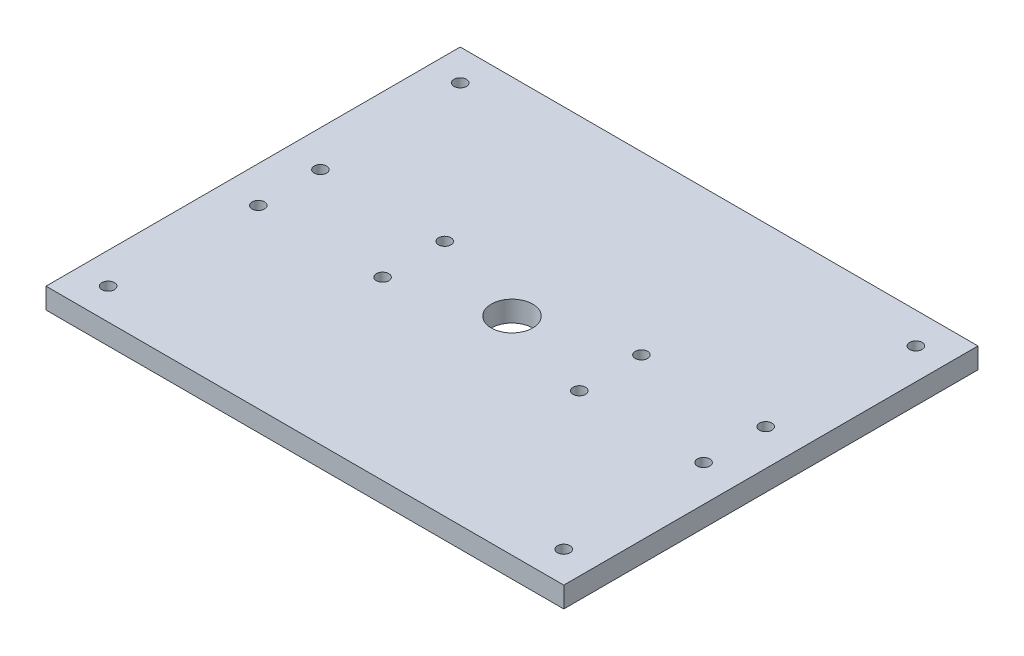
ISO-10303-21;
HEADER;
FILE_DESCRIPTION(('STEP AP214'),'2;1');
FILE_NAME('part.step','',(''),(''),'','','');
FILE_SCHEMA(('AUTOMOTIVE_DESIGN { 1 0 10303 214 1 1 1 1 }'));
ENDSEC;
DATA;
#1=APPLICATION_CONTEXT('core data for automotive mechanical design processes');
#2=APPLICATION_PROTOCOL_DEFINITION('international standard','automotive_design',2000,#1);
#3=PRODUCT_CONTEXT('',#1,'mechanical');
#4=PRODUCT('Part','Part','',(#3));
#5=PRODUCT_RELATED_PRODUCT_CATEGORY('part','',(#4));
#6=PRODUCT_DEFINITION_FORMATION('','',#4);
#7=PRODUCT_DEFINITION_CONTEXT('part definition',#1,'design');
#8=PRODUCT_DEFINITION('design','',#6,#7);
#9=PRODUCT_DEFINITION_SHAPE('','',#8);
#10=(LENGTH_UNIT() NAMED_UNIT(*) SI_UNIT(.MILLI.,.METRE.));
#11=(NAMED_UNIT(*) PLANE_ANGLE_UNIT() SI_UNIT($,.RADIAN.));
#12=(NAMED_UNIT(*) SI_UNIT($,.STERADIAN.) SOLID_ANGLE_UNIT());
#13=UNCERTAINTY_MEASURE_WITH_UNIT(LENGTH_MEASURE(1.E-05),#10,'distance_accuracy_value','');
#14=(GEOMETRIC_REPRESENTATION_CONTEXT(3) GLOBAL_UNCERTAINTY_ASSIGNED_CONTEXT((#13)) GLOBAL_UNIT_ASSIGNED_CONTEXT((#10,
#11,#12)) REPRESENTATION_CONTEXT('',''));
#15=CARTESIAN_POINT('',(0.,0.,0.));
#16=DIRECTION('',(0.,0.,1.));
#17=DIRECTION('',(1.,0.,0.));
#18=AXIS2_PLACEMENT_3D('',#15,#16,#17);
#19=CARTESIAN_POINT('',(0.,4.,0.));
#20=DIRECTION('',(0.,-1.,0.));
#21=DIRECTION('',(0.,0.,-1.));
#22=AXIS2_PLACEMENT_3D('',#19,#20,#21);
#23=PLANE('',#22);
#24=CARTESIAN_POINT('',(50.,4.,-40.));
#25=DIRECTION('',(0.,1.,0.));
#26=DIRECTION('',(0.,0.,1.));
#27=AXIS2_PLACEMENT_3D('',#24,#25,#26);
#28=CIRCLE('',#27,3.99999999999999);
#29=CARTESIAN_POINT('',(50.,4.,-36.));
#30=VERTEX_POINT('',#29);
#31=EDGE_CURVE('E302',#30,#30,#28,.T.);
#32=ORIENTED_EDGE('',*,*,#31,.F.);
#33=EDGE_LOOP('',(#32));
#34=FACE_BOUND('',#33,.T.);
#35=CARTESIAN_POINT('',(6.,4.,-74.));
#36=DIRECTION('',(0.,1.,0.));
#37=DIRECTION('',(0.,0.,1.));
#38=AXIS2_PLACEMENT_3D('',#35,#36,#37);
#39=CIRCLE('',#38,1.19999999999999);
#40=CARTESIAN_POINT('',(6.,4.,-72.8));
#41=VERTEX_POINT('',#40);
#42=EDGE_CURVE('E306',#41,#41,#39,.T.);
#43=ORIENTED_EDGE('',*,*,#42,.F.);
#44=EDGE_LOOP('',(#43));
#45=FACE_BOUND('',#44,.T.);
#46=CARTESIAN_POINT('',(94.,4.,-74.));
#47=DIRECTION('',(0.,1.,0.));
#48=DIRECTION('',(0.,0.,1.));
#49=AXIS2_PLACEMENT_3D('',#46,#47,#48);
#50=CIRCLE('',#49,1.19999999999999);
#51=CARTESIAN_POINT('',(94.,4.,-72.8));
#52=VERTEX_POINT('',#51);
#53=EDGE_CURVE('E181',#52,#52,#50,.T.);
#54=ORIENTED_EDGE('',*,*,#53,.F.);
#55=EDGE_LOOP('',(#54));
#56=FACE_BOUND('',#55,.T.);
#57=CARTESIAN_POINT('',(94.0000000000007,4.,-5.99999999999999));
#58=DIRECTION('',(0.,1.,0.));
#59=DIRECTION('',(0.,0.,1.));
#60=AXIS2_PLACEMENT_3D('',#57,#58,#59);
#61=CIRCLE('',#60,1.19999999999999);
#62=CARTESIAN_POINT('',(94.0000000000007,4.,-4.8));
#63=VERTEX_POINT('',#62);
#64=EDGE_CURVE('E167',#63,#63,#61,.T.);
#65=ORIENTED_EDGE('',*,*,#64,.F.);
#66=EDGE_LOOP('',(#65));
#67=FACE_BOUND('',#66,.T.);
#68=CARTESIAN_POINT('',(6.0000000000004,4.,-5.99999999999999));
#69=DIRECTION('',(0.,1.,0.));
#70=DIRECTION('',(0.,0.,1.));
#71=AXIS2_PLACEMENT_3D('',#68,#69,#70);
#72=CIRCLE('',#71,1.19999999999999);
#73=CARTESIAN_POINT('',(6.0000000000004,4.,-4.8));
#74=VERTEX_POINT('',#73);
#75=EDGE_CURVE('E166',#74,#74,#72,.T.);
#76=ORIENTED_EDGE('',*,*,#75,.F.);
#77=EDGE_LOOP('',(#76));
#78=FACE_BOUND('',#77,.T.);
#79=CARTESIAN_POINT('',(69.,4.,-34.));
#80=DIRECTION('',(0.,1.,0.));
#81=DIRECTION('',(0.,0.,1.));
#82=AXIS2_PLACEMENT_3D('',#79,#80,#81);
#83=CIRCLE('',#82,1.19999999999999);
#84=CARTESIAN_POINT('',(69.,4.,-32.8));
#85=VERTEX_POINT('',#84);
#86=EDGE_CURVE('E158',#85,#85,#83,.T.);
#87=ORIENTED_EDGE('',*,*,#86,.F.);
#88=EDGE_LOOP('',(#87));
#89=FACE_BOUND('',#88,.T.);
#90=CARTESIAN_POINT('',(93.,4.,-46.));
#91=DIRECTION('',(0.,1.,0.));
#92=DIRECTION('',(0.,0.,1.));
#93=AXIS2_PLACEMENT_3D('',#90,#91,#92);
#94=CIRCLE('',#93,1.19999999999999);
#95=CARTESIAN_POINT('',(93.,4.,-44.8));
#96=VERTEX_POINT('',#95);
#97=EDGE_CURVE('E152',#96,#96,#94,.T.);
#98=ORIENTED_EDGE('',*,*,#97,.F.);
#99=EDGE_LOOP('',(#98));
#100=FACE_BOUND('',#99,.T.);
#101=CARTESIAN_POINT('',(7.,4.,-34.));
#102=DIRECTION('',(0.,1.,0.));
#103=DIRECTION('',(0.,0.,1.));
#104=AXIS2_PLACEMENT_3D('',#101,#102,#103);
#105=CIRCLE('',#104,1.2);
#106=CARTESIAN_POINT('',(7.,4.,-32.8));
#107=VERTEX_POINT('',#106);
#108=EDGE_CURVE('E147',#107,#107,#105,.T.);
#109=ORIENTED_EDGE('',*,*,#108,.F.);
#110=EDGE_LOOP('',(#109));
#111=FACE_BOUND('',#110,.T.);
#112=CARTESIAN_POINT('',(31.,4.,-34.));
#113=DIRECTION('',(0.,1.,0.));
#114=DIRECTION('',(0.,0.,1.));
#115=AXIS2_PLACEMENT_3D('',#112,#113,#114);
#116=CIRCLE('',#115,1.2);
#117=CARTESIAN_POINT('',(31.,4.,-32.8));
#118=VERTEX_POINT('',#117);
#119=EDGE_CURVE('E142',#118,#118,#116,.T.);
#120=ORIENTED_EDGE('',*,*,#119,.F.);
#121=EDGE_LOOP('',(#120));
#122=FACE_BOUND('',#121,.T.);
#123=CARTESIAN_POINT('',(31.,4.,-46.));
#124=DIRECTION('',(0.,1.,0.));
#125=DIRECTION('',(0.,0.,1.));
#126=AXIS2_PLACEMENT_3D('',#123,#124,#125);
#127=CIRCLE('',#126,1.2);
#128=CARTESIAN_POINT('',(31.,4.,-44.8));
#129=VERTEX_POINT('',#128);
#130=EDGE_CURVE('E137',#129,#129,#127,.T.);
#131=ORIENTED_EDGE('',*,*,#130,.F.);
#132=EDGE_LOOP('',(#131));
#133=FACE_BOUND('',#132,.T.);
#134=CARTESIAN_POINT('',(7.,4.,-46.));
#135=DIRECTION('',(0.,1.,0.));
#136=DIRECTION('',(0.,0.,1.));
#137=AXIS2_PLACEMENT_3D('',#134,#135,#136);
#138=CIRCLE('',#137,1.2);
#139=CARTESIAN_POINT('',(7.,4.,-44.8));
#140=VERTEX_POINT('',#139);
#141=EDGE_CURVE('E136',#140,#140,#138,.T.);
#142=ORIENTED_EDGE('',*,*,#141,.F.);
#143=EDGE_LOOP('',(#142));
#144=FACE_BOUND('',#143,.T.);
#145=DIRECTION('',(0.,0.,1.));
#146=VECTOR('',#145,1.);
#147=CARTESIAN_POINT('',(0.,4.,0.));
#148=LINE('',#147,#146);
#149=CARTESIAN_POINT('',(0.,4.,-80.));
#150=VERTEX_POINT('',#149);
#151=CARTESIAN_POINT('',(0.,4.,0.));
#152=VERTEX_POINT('',#151);
#153=EDGE_CURVE('E100',#150,#152,#148,.T.);
#154=ORIENTED_EDGE('',*,*,#153,.T.);
#155=DIRECTION('',(1.,0.,0.));
#156=VECTOR('',#155,1.);
#157=CARTESIAN_POINT('',(0.,4.,0.));
#158=LINE('',#157,#156);
#159=CARTESIAN_POINT('',(100.,4.,0.));
#160=VERTEX_POINT('',#159);
#161=EDGE_CURVE('E95',#152,#160,#158,.T.);
#162=ORIENTED_EDGE('',*,*,#161,.T.);
#163=DIRECTION('',(0.,0.,-1.));
#164=VECTOR('',#163,1.);
#165=CARTESIAN_POINT('',(100.,4.,0.));
#166=LINE('',#165,#164);
#167=CARTESIAN_POINT('',(100.,4.,-80.));
#168=VERTEX_POINT('',#167);
#169=EDGE_CURVE('E98',#160,#168,#166,.T.);
#170=ORIENTED_EDGE('',*,*,#169,.T.);
#171=DIRECTION('',(-1.,0.,0.));
#172=VECTOR('',#171,1.);
#173=CARTESIAN_POINT('',(0.,4.,-80.));
#174=LINE('',#173,#172);
#175=EDGE_CURVE('E65',#168,#150,#174,.T.);
#176=ORIENTED_EDGE('',*,*,#175,.T.);
#177=EDGE_LOOP('',(#154,#162,#170,#176));
#178=FACE_BOUND('',#177,.T.);
#179=CARTESIAN_POINT('',(69.,4.,-46.));
#180=DIRECTION('',(0.,1.,0.));
#181=DIRECTION('',(0.,0.,1.));
#182=AXIS2_PLACEMENT_3D('',#179,#180,#181);
#183=CIRCLE('',#182,1.19999999999999);
#184=CARTESIAN_POINT('',(69.,4.,-44.8));
#185=VERTEX_POINT('',#184);
#186=EDGE_CURVE('E153',#185,#185,#183,.T.);
#187=ORIENTED_EDGE('',*,*,#186,.F.);
#188=EDGE_LOOP('',(#187));
#189=FACE_BOUND('',#188,.T.);
#190=CARTESIAN_POINT('',(93.,4.,-34.));
#191=DIRECTION('',(0.,1.,0.));
#192=DIRECTION('',(0.,0.,1.));
#193=AXIS2_PLACEMENT_3D('',#190,#191,#192);
#194=CIRCLE('',#193,1.19999999999999);
#195=CARTESIAN_POINT('',(93.,4.,-32.8));
#196=VERTEX_POINT('',#195);
#197=EDGE_CURVE('E162',#196,#196,#194,.T.);
#198=ORIENTED_EDGE('',*,*,#197,.F.);
#199=EDGE_LOOP('',(#198));
#200=FACE_BOUND('',#199,.T.);
#201=ADVANCED_FACE('F45',(#34,#45,#56,#67,#78,#89,#100,#111,#122,#133,#144,#178,#189,#200),#23,.F.);
#202=CARTESIAN_POINT('',(0.,4.,0.));
#203=DIRECTION('',(1.,0.,0.));
#204=DIRECTION('',(0.,0.,-1.));
#205=AXIS2_PLACEMENT_3D('',#202,#203,#204);
#206=PLANE('',#205);
#207=DIRECTION('',(0.,0.,1.));
#208=VECTOR('',#207,1.);
#209=CARTESIAN_POINT('',(0.,0.,0.));
#210=LINE('',#209,#208);
#211=CARTESIAN_POINT('',(0.,0.,-80.));
#212=VERTEX_POINT('',#211);
#213=CARTESIAN_POINT('',(0.,0.,0.));
#214=VERTEX_POINT('',#213);
#215=EDGE_CURVE('E117',#212,#214,#210,.T.);
#216=ORIENTED_EDGE('',*,*,#215,.T.);
#217=DIRECTION('',(0.,-1.,0.));
#218=VECTOR('',#217,1.);
#219=CARTESIAN_POINT('',(0.,4.,0.));
#220=LINE('',#219,#218);
#221=EDGE_CURVE('E11',#152,#214,#220,.T.);
#222=ORIENTED_EDGE('',*,*,#221,.F.);
#223=ORIENTED_EDGE('',*,*,#153,.F.);
#224=DIRECTION('',(0.,-1.,0.));
#225=VECTOR('',#224,1.);
#226=CARTESIAN_POINT('',(0.,4.,-80.));
#227=LINE('',#226,#225);
#228=EDGE_CURVE('E113',#150,#212,#227,.T.);
#229=ORIENTED_EDGE('',*,*,#228,.T.);
#230=EDGE_LOOP('',(#216,#222,#223,#229));
#231=FACE_BOUND('',#230,.T.);
#232=ADVANCED_FACE('F47',(#231),#206,.F.);
#233=CARTESIAN_POINT('',(0.,4.,0.));
#234=DIRECTION('',(0.,0.,-1.));
#235=DIRECTION('',(-1.,0.,0.));
#236=AXIS2_PLACEMENT_3D('',#233,#234,#235);
#237=PLANE('',#236);
#238=DIRECTION('',(1.,0.,0.));
#239=VECTOR('',#238,1.);
#240=CARTESIAN_POINT('',(0.,0.,0.));
#241=LINE('',#240,#239);
#242=CARTESIAN_POINT('',(100.,0.,0.));
#243=VERTEX_POINT('',#242);
#244=EDGE_CURVE('E105',#214,#243,#241,.T.);
#245=ORIENTED_EDGE('',*,*,#244,.T.);
#246=DIRECTION('',(0.,-1.,0.));
#247=VECTOR('',#246,1.);
#248=CARTESIAN_POINT('',(100.,4.,0.));
#249=LINE('',#248,#247);
#250=EDGE_CURVE('E56',#160,#243,#249,.T.);
#251=ORIENTED_EDGE('',*,*,#250,.F.);
#252=ORIENTED_EDGE('',*,*,#161,.F.);
#253=ORIENTED_EDGE('',*,*,#221,.T.);
#254=EDGE_LOOP('',(#245,#251,#252,#253));
#255=FACE_BOUND('',#254,.T.);
#256=ADVANCED_FACE('F104',(#255),#237,.F.);
#257=CARTESIAN_POINT('',(100.,4.,0.));
#258=DIRECTION('',(-1.,0.,0.));
#259=DIRECTION('',(0.,0.,1.));
#260=AXIS2_PLACEMENT_3D('',#257,#258,#259);
#261=PLANE('',#260);
#262=DIRECTION('',(0.,0.,-1.));
#263=VECTOR('',#262,1.);
#264=CARTESIAN_POINT('',(100.,0.,0.));
#265=LINE('',#264,#263);
#266=CARTESIAN_POINT('',(100.,0.,-80.));
#267=VERTEX_POINT('',#266);
#268=EDGE_CURVE('E82',#243,#267,#265,.T.);
#269=ORIENTED_EDGE('',*,*,#268,.T.);
#270=DIRECTION('',(0.,-1.,0.));
#271=VECTOR('',#270,1.);
#272=CARTESIAN_POINT('',(100.,4.,-80.));
#273=LINE('',#272,#271);
#274=EDGE_CURVE('E107',#168,#267,#273,.T.);
#275=ORIENTED_EDGE('',*,*,#274,.F.);
#276=ORIENTED_EDGE('',*,*,#169,.F.);
#277=ORIENTED_EDGE('',*,*,#250,.T.);
#278=EDGE_LOOP('',(#269,#275,#276,#277));
#279=FACE_BOUND('',#278,.T.);
#280=ADVANCED_FACE('F109',(#279),#261,.F.);
#281=CARTESIAN_POINT('',(0.,4.,-80.));
#282=DIRECTION('',(0.,0.,1.));
#283=DIRECTION('',(1.,0.,0.));
#284=AXIS2_PLACEMENT_3D('',#281,#282,#283);
#285=PLANE('',#284);
#286=DIRECTION('',(-1.,0.,0.));
#287=VECTOR('',#286,1.);
#288=CARTESIAN_POINT('',(0.,0.,-80.));
#289=LINE('',#288,#287);
#290=EDGE_CURVE('E88',#267,#212,#289,.T.);
#291=ORIENTED_EDGE('',*,*,#290,.T.);
#292=ORIENTED_EDGE('',*,*,#228,.F.);
#293=ORIENTED_EDGE('',*,*,#175,.F.);
#294=ORIENTED_EDGE('',*,*,#274,.T.);
#295=EDGE_LOOP('',(#291,#292,#293,#294));
#296=FACE_BOUND('',#295,.T.);
#297=ADVANCED_FACE('F227',(#296),#285,.F.);
#298=CARTESIAN_POINT('',(0.,0.,0.));
#299=DIRECTION('',(0.,-1.,0.));
#300=DIRECTION('',(0.,0.,-1.));
#301=AXIS2_PLACEMENT_3D('',#298,#299,#300);
#302=PLANE('',#301);
#303=CARTESIAN_POINT('',(50.,0.,-40.));
#304=DIRECTION('',(0.,1.,0.));
#305=DIRECTION('',(0.,0.,1.));
#306=AXIS2_PLACEMENT_3D('',#303,#304,#305);
#307=CIRCLE('',#306,4.);
#308=CARTESIAN_POINT('',(50.,0.,-36.));
#309=VERTEX_POINT('',#308);
#310=EDGE_CURVE('E300',#309,#309,#307,.T.);
#311=ORIENTED_EDGE('',*,*,#310,.T.);
#312=EDGE_LOOP('',(#311));
#313=FACE_BOUND('',#312,.T.);
#314=CARTESIAN_POINT('',(6.,0.,-74.));
#315=DIRECTION('',(0.,-1.,0.));
#316=DIRECTION('',(0.,0.,-1.));
#317=AXIS2_PLACEMENT_3D('',#314,#315,#316);
#318=CIRCLE('',#317,1.19999999999999);
#319=CARTESIAN_POINT('',(6.,0.,-75.2));
#320=VERTEX_POINT('',#319);
#321=EDGE_CURVE('E311',#320,#320,#318,.T.);
#322=ORIENTED_EDGE('',*,*,#321,.F.);
#323=EDGE_LOOP('',(#322));
#324=FACE_BOUND('',#323,.T.);
#325=CARTESIAN_POINT('',(94.,0.,-74.));
#326=DIRECTION('',(0.,-1.,0.));
#327=DIRECTION('',(0.,0.,-1.));
#328=AXIS2_PLACEMENT_3D('',#325,#326,#327);
#329=CIRCLE('',#328,1.19999999999999);
#330=CARTESIAN_POINT('',(94.,0.,-75.2));
#331=VERTEX_POINT('',#330);
#332=EDGE_CURVE('E49',#331,#331,#329,.T.);
#333=ORIENTED_EDGE('',*,*,#332,.F.);
#334=EDGE_LOOP('',(#333));
#335=FACE_BOUND('',#334,.T.);
#336=CARTESIAN_POINT('',(94.0000000000007,0.,-5.99999999999999));
#337=DIRECTION('',(0.,-1.,0.));
#338=DIRECTION('',(0.,0.,-1.));
#339=AXIS2_PLACEMENT_3D('',#336,#337,#338);
#340=CIRCLE('',#339,1.19999999999999);
#341=CARTESIAN_POINT('',(94.0000000000007,0.,-7.19999999999998));
#342=VERTEX_POINT('',#341);
#343=EDGE_CURVE('E163',#342,#342,#340,.T.);
#344=ORIENTED_EDGE('',*,*,#343,.F.);
#345=EDGE_LOOP('',(#344));
#346=FACE_BOUND('',#345,.T.);
#347=CARTESIAN_POINT('',(6.0000000000004,0.,-5.99999999999999));
#348=DIRECTION('',(0.,-1.,0.));
#349=DIRECTION('',(0.,0.,-1.));
#350=AXIS2_PLACEMENT_3D('',#347,#348,#349);
#351=CIRCLE('',#350,1.19999999999999);
#352=CARTESIAN_POINT('',(6.0000000000004,0.,-7.19999999999998));
#353=VERTEX_POINT('',#352);
#354=EDGE_CURVE('E173',#353,#353,#351,.T.);
#355=ORIENTED_EDGE('',*,*,#354,.F.);
#356=EDGE_LOOP('',(#355));
#357=FACE_BOUND('',#356,.T.);
#358=CARTESIAN_POINT('',(93.,0.,-34.));
#359=DIRECTION('',(0.,-1.,0.));
#360=DIRECTION('',(0.,0.,-1.));
#361=AXIS2_PLACEMENT_3D('',#358,#359,#360);
#362=CIRCLE('',#361,1.19999999999999);
#363=CARTESIAN_POINT('',(93.,0.,-35.2));
#364=VERTEX_POINT('',#363);
#365=EDGE_CURVE('E159',#364,#364,#362,.T.);
#366=ORIENTED_EDGE('',*,*,#365,.F.);
#367=EDGE_LOOP('',(#366));
#368=FACE_BOUND('',#367,.T.);
#369=CARTESIAN_POINT('',(69.,0.,-34.));
#370=DIRECTION('',(0.,-1.,0.));
#371=DIRECTION('',(0.,0.,-1.));
#372=AXIS2_PLACEMENT_3D('',#369,#370,#371);
#373=CIRCLE('',#372,1.19999999999999);
#374=CARTESIAN_POINT('',(69.,0.,-35.2));
#375=VERTEX_POINT('',#374);
#376=EDGE_CURVE('E154',#375,#375,#373,.T.);
#377=ORIENTED_EDGE('',*,*,#376,.F.);
#378=EDGE_LOOP('',(#377));
#379=FACE_BOUND('',#378,.T.);
#380=CARTESIAN_POINT('',(69.,0.,-46.));
#381=DIRECTION('',(0.,-1.,0.));
#382=DIRECTION('',(0.,0.,-1.));
#383=AXIS2_PLACEMENT_3D('',#380,#381,#382);
#384=CIRCLE('',#383,1.19999999999999);
#385=CARTESIAN_POINT('',(69.,0.,-47.2));
#386=VERTEX_POINT('',#385);
#387=EDGE_CURVE('E148',#386,#386,#384,.T.);
#388=ORIENTED_EDGE('',*,*,#387,.F.);
#389=EDGE_LOOP('',(#388));
#390=FACE_BOUND('',#389,.T.);
#391=CARTESIAN_POINT('',(93.,0.,-46.));
#392=DIRECTION('',(0.,-1.,0.));
#393=DIRECTION('',(0.,0.,-1.));
#394=AXIS2_PLACEMENT_3D('',#391,#392,#393);
#395=CIRCLE('',#394,1.19999999999999);
#396=CARTESIAN_POINT('',(93.,0.,-47.2));
#397=VERTEX_POINT('',#396);
#398=EDGE_CURVE('E200',#397,#397,#395,.T.);
#399=ORIENTED_EDGE('',*,*,#398,.F.);
#400=EDGE_LOOP('',(#399));
#401=FACE_BOUND('',#400,.T.);
#402=CARTESIAN_POINT('',(7.,0.,-34.));
#403=DIRECTION('',(0.,-1.,0.));
#404=DIRECTION('',(0.,0.,-1.));
#405=AXIS2_PLACEMENT_3D('',#402,#403,#404);
#406=CIRCLE('',#405,1.2);
#407=CARTESIAN_POINT('',(7.,0.,-35.2));
#408=VERTEX_POINT('',#407);
#409=EDGE_CURVE('E143',#408,#408,#406,.T.);
#410=ORIENTED_EDGE('',*,*,#409,.F.);
#411=EDGE_LOOP('',(#410));
#412=FACE_BOUND('',#411,.T.);
#413=CARTESIAN_POINT('',(31.,0.,-34.));
#414=DIRECTION('',(0.,-1.,0.));
#415=DIRECTION('',(0.,0.,-1.));
#416=AXIS2_PLACEMENT_3D('',#413,#414,#415);
#417=CIRCLE('',#416,1.2);
#418=CARTESIAN_POINT('',(31.,0.,-35.2));
#419=VERTEX_POINT('',#418);
#420=EDGE_CURVE('E138',#419,#419,#417,.T.);
#421=ORIENTED_EDGE('',*,*,#420,.F.);
#422=EDGE_LOOP('',(#421));
#423=FACE_BOUND('',#422,.T.);
#424=CARTESIAN_POINT('',(31.,0.,-46.));
#425=DIRECTION('',(0.,-1.,0.));
#426=DIRECTION('',(0.,0.,-1.));
#427=AXIS2_PLACEMENT_3D('',#424,#425,#426);
#428=CIRCLE('',#427,1.2);
#429=CARTESIAN_POINT('',(31.,0.,-47.2));
#430=VERTEX_POINT('',#429);
#431=EDGE_CURVE('E132',#430,#430,#428,.T.);
#432=ORIENTED_EDGE('',*,*,#431,.F.);
#433=EDGE_LOOP('',(#432));
#434=FACE_BOUND('',#433,.T.);
#435=CARTESIAN_POINT('',(7.,0.,-46.));
#436=DIRECTION('',(0.,-1.,0.));
#437=DIRECTION('',(0.,0.,-1.));
#438=AXIS2_PLACEMENT_3D('',#435,#436,#437);
#439=CIRCLE('',#438,1.2);
#440=CARTESIAN_POINT('',(7.,0.,-47.2));
#441=VERTEX_POINT('',#440);
#442=EDGE_CURVE('E121',#441,#441,#439,.T.);
#443=ORIENTED_EDGE('',*,*,#442,.F.);
#444=EDGE_LOOP('',(#443));
#445=FACE_BOUND('',#444,.T.);
#446=ORIENTED_EDGE('',*,*,#215,.F.);
#447=ORIENTED_EDGE('',*,*,#290,.F.);
#448=ORIENTED_EDGE('',*,*,#268,.F.);
#449=ORIENTED_EDGE('',*,*,#244,.F.);
#450=EDGE_LOOP('',(#446,#447,#448,#449));
#451=FACE_BOUND('',#450,.T.);
#452=ADVANCED_FACE('F224',(#313,#324,#335,#346,#357,#368,#379,#390,#401,#412,#423,#434,#445,
#451),#302,.T.);
#453=CARTESIAN_POINT('',(7.,4.,-46.));
#454=DIRECTION('',(0.,1.,0.));
#455=DIRECTION('',(0.,0.,1.));
#456=AXIS2_PLACEMENT_3D('',#453,#454,#455);
#457=CYLINDRICAL_SURFACE('',#456,1.2);
#458=ORIENTED_EDGE('',*,*,#442,.T.);
#459=EDGE_LOOP('',(#458));
#460=FACE_BOUND('',#459,.T.);
#461=ORIENTED_EDGE('',*,*,#141,.T.);
#462=EDGE_LOOP('',(#461));
#463=FACE_BOUND('',#462,.T.);
#464=ADVANCED_FACE('F221',(#460,#463),#457,.F.);
#465=CARTESIAN_POINT('',(31.,4.,-46.));
#466=DIRECTION('',(0.,1.,0.));
#467=DIRECTION('',(0.,0.,1.));
#468=AXIS2_PLACEMENT_3D('',#465,#466,#467);
#469=CYLINDRICAL_SURFACE('',#468,1.2);
#470=ORIENTED_EDGE('',*,*,#431,.T.);
#471=EDGE_LOOP('',(#470));
#472=FACE_BOUND('',#471,.T.);
#473=ORIENTED_EDGE('',*,*,#130,.T.);
#474=EDGE_LOOP('',(#473));
#475=FACE_BOUND('',#474,.T.);
#476=ADVANCED_FACE('F250',(#472,#475),#469,.F.);
#477=CARTESIAN_POINT('',(31.,4.,-34.));
#478=DIRECTION('',(0.,1.,0.));
#479=DIRECTION('',(0.,0.,1.));
#480=AXIS2_PLACEMENT_3D('',#477,#478,#479);
#481=CYLINDRICAL_SURFACE('',#480,1.2);
#482=ORIENTED_EDGE('',*,*,#420,.T.);
#483=EDGE_LOOP('',(#482));
#484=FACE_BOUND('',#483,.T.);
#485=ORIENTED_EDGE('',*,*,#119,.T.);
#486=EDGE_LOOP('',(#485));
#487=FACE_BOUND('',#486,.T.);
#488=ADVANCED_FACE('F253',(#484,#487),#481,.F.);
#489=CARTESIAN_POINT('',(7.,4.,-34.));
#490=DIRECTION('',(0.,1.,0.));
#491=DIRECTION('',(0.,0.,1.));
#492=AXIS2_PLACEMENT_3D('',#489,#490,#491);
#493=CYLINDRICAL_SURFACE('',#492,1.2);
#494=ORIENTED_EDGE('',*,*,#409,.T.);
#495=EDGE_LOOP('',(#494));
#496=FACE_BOUND('',#495,.T.);
#497=ORIENTED_EDGE('',*,*,#108,.T.);
#498=EDGE_LOOP('',(#497));
#499=FACE_BOUND('',#498,.T.);
#500=ADVANCED_FACE('F257',(#496,#499),#493,.F.);
#501=CARTESIAN_POINT('',(93.,4.,-46.));
#502=DIRECTION('',(0.,1.,0.));
#503=DIRECTION('',(0.,0.,1.));
#504=AXIS2_PLACEMENT_3D('',#501,#502,#503);
#505=CYLINDRICAL_SURFACE('',#504,1.19999999999999);
#506=ORIENTED_EDGE('',*,*,#398,.T.);
#507=EDGE_LOOP('',(#506));
#508=FACE_BOUND('',#507,.T.);
#509=ORIENTED_EDGE('',*,*,#97,.T.);
#510=EDGE_LOOP('',(#509));
#511=FACE_BOUND('',#510,.T.);
#512=ADVANCED_FACE('F261',(#508,#511),#505,.F.);
#513=CARTESIAN_POINT('',(69.,4.,-46.));
#514=DIRECTION('',(0.,1.,0.));
#515=DIRECTION('',(0.,0.,1.));
#516=AXIS2_PLACEMENT_3D('',#513,#514,#515);
#517=CYLINDRICAL_SURFACE('',#516,1.19999999999999);
#518=ORIENTED_EDGE('',*,*,#387,.T.);
#519=EDGE_LOOP('',(#518));
#520=FACE_BOUND('',#519,.T.);
#521=ORIENTED_EDGE('',*,*,#186,.T.);
#522=EDGE_LOOP('',(#521));
#523=FACE_BOUND('',#522,.T.);
#524=ADVANCED_FACE('F265',(#520,#523),#517,.F.);
#525=CARTESIAN_POINT('',(69.,4.,-34.));
#526=DIRECTION('',(0.,1.,0.));
#527=DIRECTION('',(0.,0.,1.));
#528=AXIS2_PLACEMENT_3D('',#525,#526,#527);
#529=CYLINDRICAL_SURFACE('',#528,1.19999999999999);
#530=ORIENTED_EDGE('',*,*,#376,.T.);
#531=EDGE_LOOP('',(#530));
#532=FACE_BOUND('',#531,.T.);
#533=ORIENTED_EDGE('',*,*,#86,.T.);
#534=EDGE_LOOP('',(#533));
#535=FACE_BOUND('',#534,.T.);
#536=ADVANCED_FACE('F269',(#532,#535),#529,.F.);
#537=CARTESIAN_POINT('',(93.,4.,-34.));
#538=DIRECTION('',(0.,1.,0.));
#539=DIRECTION('',(0.,0.,1.));
#540=AXIS2_PLACEMENT_3D('',#537,#538,#539);
#541=CYLINDRICAL_SURFACE('',#540,1.19999999999999);
#542=ORIENTED_EDGE('',*,*,#365,.T.);
#543=EDGE_LOOP('',(#542));
#544=FACE_BOUND('',#543,.T.);
#545=ORIENTED_EDGE('',*,*,#197,.T.);
#546=EDGE_LOOP('',(#545));
#547=FACE_BOUND('',#546,.T.);
#548=ADVANCED_FACE('F273',(#544,#547),#541,.F.);
#549=CARTESIAN_POINT('',(6.0000000000004,4.,-5.99999999999999));
#550=DIRECTION('',(0.,1.,0.));
#551=DIRECTION('',(0.,0.,1.));
#552=AXIS2_PLACEMENT_3D('',#549,#550,#551);
#553=CYLINDRICAL_SURFACE('',#552,1.19999999999999);
#554=ORIENTED_EDGE('',*,*,#354,.T.);
#555=EDGE_LOOP('',(#554));
#556=FACE_BOUND('',#555,.T.);
#557=ORIENTED_EDGE('',*,*,#75,.T.);
#558=EDGE_LOOP('',(#557));
#559=FACE_BOUND('',#558,.T.);
#560=ADVANCED_FACE('F277',(#556,#559),#553,.F.);
#561=CARTESIAN_POINT('',(94.0000000000007,4.,-5.99999999999999));
#562=DIRECTION('',(0.,1.,0.));
#563=DIRECTION('',(0.,0.,1.));
#564=AXIS2_PLACEMENT_3D('',#561,#562,#563);
#565=CYLINDRICAL_SURFACE('',#564,1.19999999999999);
#566=ORIENTED_EDGE('',*,*,#343,.T.);
#567=EDGE_LOOP('',(#566));
#568=FACE_BOUND('',#567,.T.);
#569=ORIENTED_EDGE('',*,*,#64,.T.);
#570=EDGE_LOOP('',(#569));
#571=FACE_BOUND('',#570,.T.);
#572=ADVANCED_FACE('F281',(#568,#571),#565,.F.);
#573=CARTESIAN_POINT('',(94.,4.,-74.));
#574=DIRECTION('',(0.,1.,0.));
#575=DIRECTION('',(0.,0.,1.));
#576=AXIS2_PLACEMENT_3D('',#573,#574,#575);
#577=CYLINDRICAL_SURFACE('',#576,1.19999999999999);
#578=ORIENTED_EDGE('',*,*,#332,.T.);
#579=EDGE_LOOP('',(#578));
#580=FACE_BOUND('',#579,.T.);
#581=ORIENTED_EDGE('',*,*,#53,.T.);
#582=EDGE_LOOP('',(#581));
#583=FACE_BOUND('',#582,.T.);
#584=ADVANCED_FACE('F285',(#580,#583),#577,.F.);
#585=CARTESIAN_POINT('',(6.,4.,-74.));
#586=DIRECTION('',(0.,1.,0.));
#587=DIRECTION('',(0.,0.,1.));
#588=AXIS2_PLACEMENT_3D('',#585,#586,#587);
#589=CYLINDRICAL_SURFACE('',#588,1.19999999999999);
#590=ORIENTED_EDGE('',*,*,#321,.T.);
#591=EDGE_LOOP('',(#590));
#592=FACE_BOUND('',#591,.T.);
#593=ORIENTED_EDGE('',*,*,#42,.T.);
#594=EDGE_LOOP('',(#593));
#595=FACE_BOUND('',#594,.T.);
#596=ADVANCED_FACE('F288',(#592,#595),#589,.F.);
#597=CARTESIAN_POINT('',(50.,4.,-40.));
#598=DIRECTION('',(0.,1.,0.));
#599=DIRECTION('',(0.,0.,1.));
#600=AXIS2_PLACEMENT_3D('',#597,#598,#599);
#601=CYLINDRICAL_SURFACE('',#600,3.99999999999999);
#602=ORIENTED_EDGE('',*,*,#310,.F.);
#603=EDGE_LOOP('',(#602));
#604=FACE_BOUND('',#603,.T.);
#605=ORIENTED_EDGE('',*,*,#31,.T.);
#606=EDGE_LOOP('',(#605));
#607=FACE_BOUND('',#606,.T.);
#608=ADVANCED_FACE('F291',(#604,#607),#601,.F.);
#609=CLOSED_SHELL('',(#201,#232,#256,#280,#297,#452,#464,#476,#488,#500,#512,#524,#536,#548,
#560,#572,#584,#596,#608));
#610=MANIFOLD_SOLID_BREP('B2',#609);
#611=ADVANCED_BREP_SHAPE_REPRESENTATION('',(#18,#610),#14);
#612=SHAPE_DEFINITION_REPRESENTATION(#9,#611);
ENDSEC;
END-ISO-10303-21;
